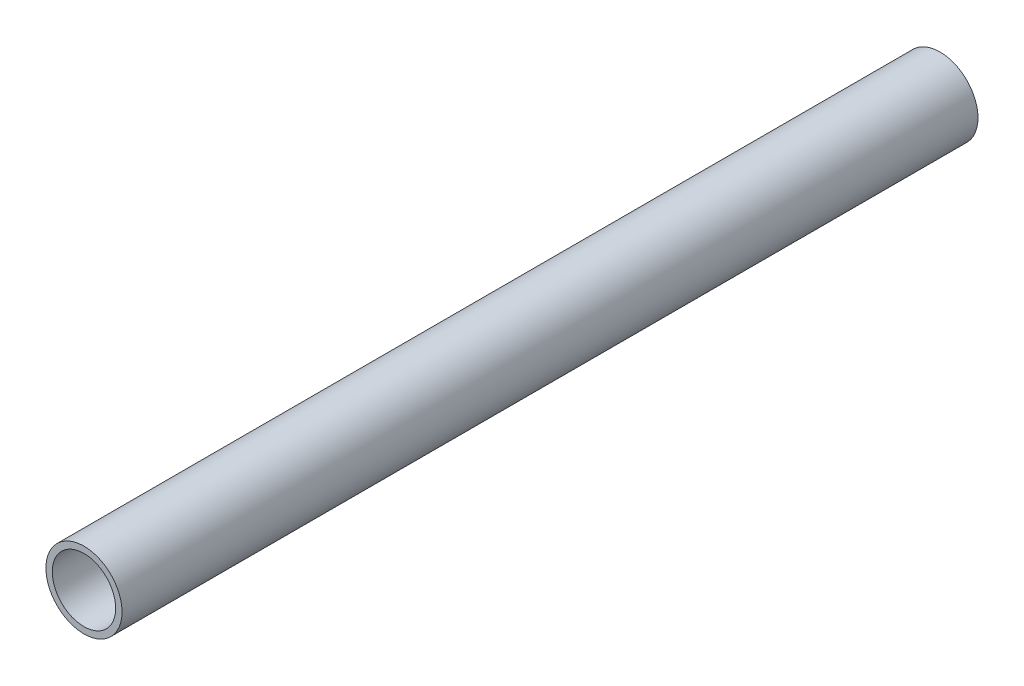
ISO-10303-21;
HEADER;
FILE_DESCRIPTION(('STEP AP214'),'2;1');
FILE_NAME('part.step','',(''),(''),'','','');
FILE_SCHEMA(('AUTOMOTIVE_DESIGN { 1 0 10303 214 1 1 1 1 }'));
ENDSEC;
DATA;
#1=APPLICATION_CONTEXT('core data for automotive mechanical design processes');
#2=APPLICATION_PROTOCOL_DEFINITION('international standard','automotive_design',2000,#1);
#3=PRODUCT_CONTEXT('',#1,'mechanical');
#4=PRODUCT('Part','Part','',(#3));
#5=PRODUCT_RELATED_PRODUCT_CATEGORY('part','',(#4));
#6=PRODUCT_DEFINITION_FORMATION('','',#4);
#7=PRODUCT_DEFINITION_CONTEXT('part definition',#1,'design');
#8=PRODUCT_DEFINITION('design','',#6,#7);
#9=PRODUCT_DEFINITION_SHAPE('','',#8);
#10=(LENGTH_UNIT() NAMED_UNIT(*) SI_UNIT(.MILLI.,.METRE.));
#11=(NAMED_UNIT(*) PLANE_ANGLE_UNIT() SI_UNIT($,.RADIAN.));
#12=(NAMED_UNIT(*) SI_UNIT($,.STERADIAN.) SOLID_ANGLE_UNIT());
#13=UNCERTAINTY_MEASURE_WITH_UNIT(LENGTH_MEASURE(1.E-05),#10,'distance_accuracy_value','');
#14=(GEOMETRIC_REPRESENTATION_CONTEXT(3) GLOBAL_UNCERTAINTY_ASSIGNED_CONTEXT((#13)) GLOBAL_UNIT_ASSIGNED_CONTEXT((#10,
#11,#12)) REPRESENTATION_CONTEXT('',''));
#15=CARTESIAN_POINT('',(0.,0.,0.));
#16=DIRECTION('',(0.,0.,1.));
#17=DIRECTION('',(1.,0.,0.));
#18=AXIS2_PLACEMENT_3D('',#15,#16,#17);
#19=CARTESIAN_POINT('',(0.,0.,135.));
#20=DIRECTION('',(0.,0.,1.));
#21=DIRECTION('',(1.,0.,0.));
#22=AXIS2_PLACEMENT_3D('',#19,#20,#21);
#23=PLANE('',#22);
#24=CARTESIAN_POINT('',(0.,0.,135.));
#25=DIRECTION('',(0.,0.,1.));
#26=DIRECTION('',(1.,0.,0.));
#27=AXIS2_PLACEMENT_3D('',#24,#25,#26);
#28=CIRCLE('',#27,6.);
#29=CARTESIAN_POINT('',(6.,0.,135.));
#30=VERTEX_POINT('',#29);
#31=EDGE_CURVE('E11',#30,#30,#28,.T.);
#32=ORIENTED_EDGE('',*,*,#31,.T.);
#33=EDGE_LOOP('',(#32));
#34=FACE_BOUND('',#33,.T.);
#35=CARTESIAN_POINT('',(0.,0.,135.));
#36=DIRECTION('',(0.,0.,1.));
#37=DIRECTION('',(1.,0.,0.));
#38=AXIS2_PLACEMENT_3D('',#35,#36,#37);
#39=CIRCLE('',#38,5.);
#40=CARTESIAN_POINT('',(5.,0.,135.));
#41=VERTEX_POINT('',#40);
#42=EDGE_CURVE('E49',#41,#41,#39,.T.);
#43=ORIENTED_EDGE('',*,*,#42,.F.);
#44=EDGE_LOOP('',(#43));
#45=FACE_BOUND('',#44,.T.);
#46=ADVANCED_FACE('F38',(#34,#45),#23,.T.);
#47=CARTESIAN_POINT('',(0.,0.,0.));
#48=DIRECTION('',(0.,0.,1.));
#49=DIRECTION('',(1.,0.,0.));
#50=AXIS2_PLACEMENT_3D('',#47,#48,#49);
#51=PLANE('',#50);
#52=CARTESIAN_POINT('',(0.,0.,0.));
#53=DIRECTION('',(0.,0.,1.));
#54=DIRECTION('',(1.,0.,0.));
#55=AXIS2_PLACEMENT_3D('',#52,#53,#54);
#56=CIRCLE('',#55,6.);
#57=CARTESIAN_POINT('',(6.,0.,0.));
#58=VERTEX_POINT('',#57);
#59=EDGE_CURVE('E42',#58,#58,#56,.T.);
#60=ORIENTED_EDGE('',*,*,#59,.F.);
#61=EDGE_LOOP('',(#60));
#62=FACE_BOUND('',#61,.T.);
#63=CARTESIAN_POINT('',(0.,0.,0.));
#64=DIRECTION('',(0.,0.,1.));
#65=DIRECTION('',(1.,0.,0.));
#66=AXIS2_PLACEMENT_3D('',#63,#64,#65);
#67=CIRCLE('',#66,5.);
#68=CARTESIAN_POINT('',(5.,0.,0.));
#69=VERTEX_POINT('',#68);
#70=EDGE_CURVE('E51',#69,#69,#67,.T.);
#71=ORIENTED_EDGE('',*,*,#70,.T.);
#72=EDGE_LOOP('',(#71));
#73=FACE_BOUND('',#72,.T.);
#74=ADVANCED_FACE('F61',(#62,#73),#51,.F.);
#75=CARTESIAN_POINT('',(0.,0.,135.));
#76=DIRECTION('',(0.,0.,-1.));
#77=DIRECTION('',(-1.,0.,0.));
#78=AXIS2_PLACEMENT_3D('',#75,#76,#77);
#79=CYLINDRICAL_SURFACE('',#78,6.);
#80=ORIENTED_EDGE('',*,*,#31,.F.);
#81=EDGE_LOOP('',(#80));
#82=FACE_BOUND('',#81,.T.);
#83=ORIENTED_EDGE('',*,*,#59,.T.);
#84=EDGE_LOOP('',(#83));
#85=FACE_BOUND('',#84,.T.);
#86=ADVANCED_FACE('F40',(#82,#85),#79,.T.);
#87=CARTESIAN_POINT('',(0.,0.,135.));
#88=DIRECTION('',(0.,0.,-1.));
#89=DIRECTION('',(-1.,0.,0.));
#90=AXIS2_PLACEMENT_3D('',#87,#88,#89);
#91=CYLINDRICAL_SURFACE('',#90,5.);
#92=ORIENTED_EDGE('',*,*,#42,.T.);
#93=EDGE_LOOP('',(#92));
#94=FACE_BOUND('',#93,.T.);
#95=ORIENTED_EDGE('',*,*,#70,.F.);
#96=EDGE_LOOP('',(#95));
#97=FACE_BOUND('',#96,.T.);
#98=ADVANCED_FACE('F57',(#94,#97),#91,.F.);
#99=CLOSED_SHELL('',(#46,#74,#86,#98));
#100=MANIFOLD_SOLID_BREP('B2',#99);
#101=ADVANCED_BREP_SHAPE_REPRESENTATION('',(#18,#100),#14);
#102=SHAPE_DEFINITION_REPRESENTATION(#9,#101);
ENDSEC;
END-ISO-10303-21;
